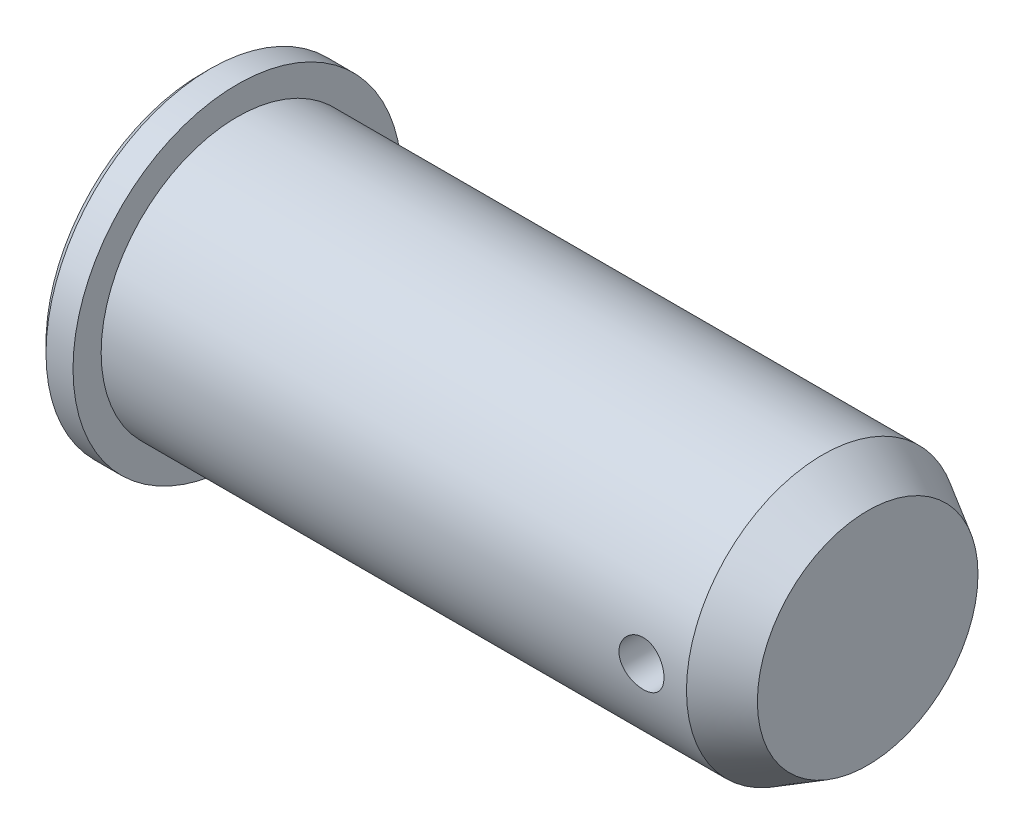
ISO-10303-21;
HEADER;
FILE_DESCRIPTION(('STEP AP214'),'2;1');
FILE_NAME('part.step','',(''),(''),'','','');
FILE_SCHEMA(('AUTOMOTIVE_DESIGN { 1 0 10303 214 1 1 1 1 }'));
ENDSEC;
DATA;
#1=APPLICATION_CONTEXT('core data for automotive mechanical design processes');
#2=APPLICATION_PROTOCOL_DEFINITION('international standard','automotive_design',2000,#1);
#3=PRODUCT_CONTEXT('',#1,'mechanical');
#4=PRODUCT('Part','Part','',(#3));
#5=PRODUCT_RELATED_PRODUCT_CATEGORY('part','',(#4));
#6=PRODUCT_DEFINITION_FORMATION('','',#4);
#7=PRODUCT_DEFINITION_CONTEXT('part definition',#1,'design');
#8=PRODUCT_DEFINITION('design','',#6,#7);
#9=PRODUCT_DEFINITION_SHAPE('','',#8);
#10=(LENGTH_UNIT() NAMED_UNIT(*) SI_UNIT(.MILLI.,.METRE.));
#11=(NAMED_UNIT(*) PLANE_ANGLE_UNIT() SI_UNIT($,.RADIAN.));
#12=(NAMED_UNIT(*) SI_UNIT($,.STERADIAN.) SOLID_ANGLE_UNIT());
#13=UNCERTAINTY_MEASURE_WITH_UNIT(LENGTH_MEASURE(1.E-05),#10,'distance_accuracy_value','');
#14=(GEOMETRIC_REPRESENTATION_CONTEXT(3) GLOBAL_UNCERTAINTY_ASSIGNED_CONTEXT((#13)) GLOBAL_UNIT_ASSIGNED_CONTEXT((#10,
#11,#12)) REPRESENTATION_CONTEXT('',''));
#15=CARTESIAN_POINT('',(0.,0.,0.));
#16=DIRECTION('',(0.,0.,1.));
#17=DIRECTION('',(1.,0.,0.));
#18=AXIS2_PLACEMENT_3D('',#15,#16,#17);
#19=CARTESIAN_POINT('',(0.,0.,0.));
#20=DIRECTION('',(1.,0.,0.));
#21=DIRECTION('',(0.,0.,-1.));
#22=AXIS2_PLACEMENT_3D('',#19,#20,#21);
#23=PLANE('',#22);
#24=CARTESIAN_POINT('',(0.,0.,0.));
#25=DIRECTION('',(1.,0.,0.));
#26=DIRECTION('',(0.,0.,-1.));
#27=AXIS2_PLACEMENT_3D('',#24,#25,#26);
#28=CIRCLE('',#27,34.5);
#29=CARTESIAN_POINT('',(0.,0.,-34.5));
#30=VERTEX_POINT('',#29);
#31=EDGE_CURVE('E44',#30,#30,#28,.F.);
#32=ORIENTED_EDGE('',*,*,#31,.T.);
#33=EDGE_LOOP('',(#32));
#34=FACE_BOUND('',#33,.T.);
#35=ADVANCED_FACE('F32',(#34),#23,.F.);
#36=CARTESIAN_POINT('',(0.,0.,0.));
#37=DIRECTION('',(-1.,0.,0.));
#38=DIRECTION('',(0.,0.,1.));
#39=AXIS2_PLACEMENT_3D('',#36,#37,#38);
#40=CYLINDRICAL_SURFACE('',#39,36.5);
#41=CARTESIAN_POINT('',(1.99999999999998,0.,0.));
#42=DIRECTION('',(1.,0.,0.));
#43=DIRECTION('',(0.,0.,-1.));
#44=AXIS2_PLACEMENT_3D('',#41,#42,#43);
#45=CIRCLE('',#44,36.5);
#46=CARTESIAN_POINT('',(1.99999999999998,0.,-36.5));
#47=VERTEX_POINT('',#46);
#48=EDGE_CURVE('E10',#47,#47,#45,.T.);
#49=ORIENTED_EDGE('',*,*,#48,.T.);
#50=EDGE_LOOP('',(#49));
#51=FACE_BOUND('',#50,.T.);
#52=CARTESIAN_POINT('',(8.,0.,0.));
#53=DIRECTION('',(-1.,0.,0.));
#54=DIRECTION('',(0.,0.,1.));
#55=AXIS2_PLACEMENT_3D('',#52,#53,#54);
#56=CIRCLE('',#55,36.5);
#57=CARTESIAN_POINT('',(8.,0.,36.5));
#58=VERTEX_POINT('',#57);
#59=EDGE_CURVE('E49',#58,#58,#56,.T.);
#60=ORIENTED_EDGE('',*,*,#59,.T.);
#61=EDGE_LOOP('',(#60));
#62=FACE_BOUND('',#61,.T.);
#63=ADVANCED_FACE('F80',(#51,#62),#40,.T.);
#64=CARTESIAN_POINT('',(8.,36.5,0.));
#65=DIRECTION('',(-1.,0.,0.));
#66=DIRECTION('',(0.,0.,1.));
#67=AXIS2_PLACEMENT_3D('',#64,#65,#66);
#68=PLANE('',#67);
#69=ORIENTED_EDGE('',*,*,#59,.F.);
#70=EDGE_LOOP('',(#69));
#71=FACE_BOUND('',#70,.T.);
#72=CARTESIAN_POINT('',(8.,0.,0.));
#73=DIRECTION('',(-1.,0.,0.));
#74=DIRECTION('',(0.,0.,1.));
#75=AXIS2_PLACEMENT_3D('',#72,#73,#74);
#76=CIRCLE('',#75,30.25);
#77=CARTESIAN_POINT('',(8.,0.,30.25));
#78=VERTEX_POINT('',#77);
#79=EDGE_CURVE('E95',#78,#78,#76,.T.);
#80=ORIENTED_EDGE('',*,*,#79,.T.);
#81=EDGE_LOOP('',(#80));
#82=FACE_BOUND('',#81,.T.);
#83=ADVANCED_FACE('F75',(#71,#82),#68,.F.);
#84=CARTESIAN_POINT('',(0.,0.,0.));
#85=DIRECTION('',(-1.,0.,0.));
#86=DIRECTION('',(0.,0.,1.));
#87=AXIS2_PLACEMENT_3D('',#84,#85,#86);
#88=CYLINDRICAL_SURFACE('',#87,30.25);
#89=CARTESIAN_POINT('',(133.,0.,30.25));
#90=CARTESIAN_POINT('',(133.000002126859,-0.139455638947402,30.2500009179522));
#91=CARTESIAN_POINT('',(132.994163818373,-0.278882400769712,30.2490338507295));
#92=CARTESIAN_POINT('',(132.970858655616,-0.556777272751613,30.2451945756554));
#93=CARTESIAN_POINT('',(132.953389486641,-0.695245186543638,30.2423219885796));
#94=CARTESIAN_POINT('',(132.906937833428,-0.970271296017669,30.2347485000166));
#95=CARTESIAN_POINT('',(132.877948037102,-1.10682822171105,30.23004643741));
#96=CARTESIAN_POINT('',(132.808664560122,-1.37702692567407,30.2189441547343));
#97=CARTESIAN_POINT('',(132.768366732031,-1.5106676149392,30.2125433116518));
#98=CARTESIAN_POINT('',(132.676829074361,-1.7738835271414,30.1982315866526));
#99=CARTESIAN_POINT('',(132.625602347021,-1.90346340694695,30.190322514089));
#100=CARTESIAN_POINT('',(132.512534266289,-2.15787371759553,30.1732057191485));
#101=CARTESIAN_POINT('',(132.45068900123,-2.28270237740314,30.1639975184211));
#102=CARTESIAN_POINT('',(132.316875749848,-2.52664355944191,30.144544096046));
#103=CARTESIAN_POINT('',(132.244912820146,-2.6457588974443,30.1342993931356));
#104=CARTESIAN_POINT('',(132.091319756201,-2.87757582316959,30.1130472170553));
#105=CARTESIAN_POINT('',(132.009686028237,-2.99027500343512,30.102039460965));
#106=CARTESIAN_POINT('',(131.83664276792,-3.20933189329885,30.0794765979095));
#107=CARTESIAN_POINT('',(131.745159779859,-3.3156312021363,30.0679177958889));
#108=CARTESIAN_POINT('',(131.553564644467,-3.52020245445551,30.0446547511578));
#109=CARTESIAN_POINT('',(131.453449315073,-3.61847141155652,30.032950456188));
#110=CARTESIAN_POINT('',(131.245337687113,-3.80623415171663,30.009732256655));
#111=CARTESIAN_POINT('',(131.137343796845,-3.89573059689259,29.9982182952204));
#112=CARTESIAN_POINT('',(130.914145944856,-4.0653919313069,29.9756971021855));
#113=CARTESIAN_POINT('',(130.798939338604,-4.14555336670428,29.9646900590438));
#114=CARTESIAN_POINT('',(130.561465578005,-4.29636938529597,29.9434391094942));
#115=CARTESIAN_POINT('',(130.439161945184,-4.36696721775163,29.933199906938));
#116=CARTESIAN_POINT('',(130.188907491808,-4.49762376501559,29.913847026984));
#117=CARTESIAN_POINT('',(130.060954584238,-4.55767854342854,29.9047337703484));
#118=CARTESIAN_POINT('',(129.800389201827,-4.66674686844475,29.8879077160845));
#119=CARTESIAN_POINT('',(129.667778718338,-4.71576506888978,29.8801943284345));
#120=CARTESIAN_POINT('',(129.398797512757,-4.80243382822669,29.8663862409762));
#121=CARTESIAN_POINT('',(129.26242543727,-4.84008023583317,29.860292132385));
#122=CARTESIAN_POINT('',(128.851728284335,-4.9348566895937,29.8448318664841));
#123=CARTESIAN_POINT('',(128.573144946642,-4.97494023323195,29.838109465173));
#124=CARTESIAN_POINT('',(128.01328456859,-5.0078499783523,29.8326027797222));
#125=CARTESIAN_POINT('',(127.732007717095,-5.00067946933101,29.8338179430247));
#126=CARTESIAN_POINT('',(127.177566791931,-4.93969180756979,29.8439754095978));
#127=CARTESIAN_POINT('',(126.904349391953,-4.886348069071,29.8528392877382));
#128=CARTESIAN_POINT('',(126.37080742075,-4.73525416789614,29.8771763703942));
#129=CARTESIAN_POINT('',(126.110483285399,-4.63750250508856,29.892649798184));
#130=CARTESIAN_POINT('',(125.608684669744,-4.39989085316462,29.9285464530083));
#131=CARTESIAN_POINT('',(125.367305169097,-4.25983388525597,29.9489927456377));
#132=CARTESIAN_POINT('',(124.911295082866,-3.94172602280416,29.9925155362905));
#133=CARTESIAN_POINT('',(124.696666623592,-3.76367211111488,30.0155922431139));
#134=CARTESIAN_POINT('',(124.297508762645,-3.3720431825576,30.0621205191662));
#135=CARTESIAN_POINT('',(124.113377965752,-3.15806179423527,30.0855732298983));
#136=CARTESIAN_POINT('',(123.78357592905,-2.7020272679772,30.1299509827977));
#137=CARTESIAN_POINT('',(123.637904929537,-2.45997395466277,30.1508760091717));
#138=CARTESIAN_POINT('',(123.38912257457,-1.95429434555043,30.1878697127002));
#139=CARTESIAN_POINT('',(123.28604604666,-1.69065060644195,30.2039344129259));
#140=CARTESIAN_POINT('',(123.125746518951,-1.14946879203915,30.2293653631587));
#141=CARTESIAN_POINT('',(123.06851974718,-0.871931861707351,30.2387321641823));
#142=CARTESIAN_POINT('',(123.002083652741,-0.314277946578055,30.2496379326016));
#143=CARTESIAN_POINT('',(122.992327054807,-0.0342278448328487,30.2512661121133));
#144=CARTESIAN_POINT('',(123.019649766251,0.523505861203211,30.2467554011814));
#145=CARTESIAN_POINT('',(123.056727304202,0.801189554599885,30.2406168045043));
#146=CARTESIAN_POINT('',(123.176210591497,1.34462042608354,30.2213175137807));
#147=CARTESIAN_POINT('',(123.258345768447,1.61042871214491,30.2081987498463));
#148=CARTESIAN_POINT('',(123.465324718166,2.12450244656325,30.1764043312468));
#149=CARTESIAN_POINT('',(123.590170856396,2.3727669223725,30.1577283688148));
#150=CARTESIAN_POINT('',(123.880283604538,2.84708544424052,30.1166703987549));
#151=CARTESIAN_POINT('',(124.045892528749,3.07292739503225,30.0942575527646));
#152=CARTESIAN_POINT('',(124.412359442995,3.49380974600917,30.0483061052849));
#153=CARTESIAN_POINT('',(124.613219948643,3.68884794609758,30.0247674235411));
#154=CARTESIAN_POINT('',(125.046937516672,4.04461212288573,29.9789291324084));
#155=CARTESIAN_POINT('',(125.280099490977,4.20496858526367,29.9566445763081));
#156=CARTESIAN_POINT('',(125.770383781267,4.48423645106497,29.9161181452449));
#157=CARTESIAN_POINT('',(126.027505346545,4.60314915245814,29.8978761436805));
#158=CARTESIAN_POINT('',(126.557317655249,4.79560433115695,29.867610825984));
#159=CARTESIAN_POINT('',(126.829939924203,4.8693316274071,29.8555622105322));
#160=CARTESIAN_POINT('',(127.384070229103,4.9698878685979,29.8389916440146));
#161=CARTESIAN_POINT('',(127.665577504395,4.99672081717076,29.8344690504119));
#162=CARTESIAN_POINT('',(128.086203724859,5.00120216452355,29.8337117032016));
#163=CARTESIAN_POINT('',(128.225352620461,4.99685885130023,29.8344427474576));
#164=CARTESIAN_POINT('',(128.502767535132,4.97659797500553,29.8378302016414));
#165=CARTESIAN_POINT('',(128.641033866142,4.96068475928357,29.8404858883905));
#166=CARTESIAN_POINT('',(128.915750978702,4.91739303740641,29.8476501119408));
#167=CARTESIAN_POINT('',(129.052201093401,4.8900104337176,29.852159310914));
#168=CARTESIAN_POINT('',(129.322234928827,4.82400282452436,29.8628969682249));
#169=CARTESIAN_POINT('',(129.455819663181,4.78538186742972,29.8691248074124));
#170=CARTESIAN_POINT('',(129.71913390499,4.69721639725925,29.8831164070874));
#171=CARTESIAN_POINT('',(129.848866328239,4.64768039790723,29.8908789700095));
#172=CARTESIAN_POINT('',(130.103645786332,4.53805027453649,29.9077192745733));
#173=CARTESIAN_POINT('',(130.228694480925,4.47795993438399,29.9167965446716));
#174=CARTESIAN_POINT('',(130.473353078271,4.34761363078593,29.9360166836689));
#175=CARTESIAN_POINT('',(130.592960829793,4.27735369163136,29.9461599688896));
#176=CARTESIAN_POINT('',(130.825838471266,4.12720543642081,29.9672223915387));
#177=CARTESIAN_POINT('',(130.93911057051,4.04732050771319,29.9781412554636));
#178=CARTESIAN_POINT('',(131.15992833887,3.87743356763734,30.00059059036));
#179=CARTESIAN_POINT('',(131.26738860573,3.78732129201922,30.0121268437462));
#180=CARTESIAN_POINT('',(131.474316457888,3.59843613951504,30.0353592582278));
#181=CARTESIAN_POINT('',(131.573786885365,3.49966636868972,30.0470553607132));
#182=CARTESIAN_POINT('',(131.76415264477,3.29405451597666,30.0702911920451));
#183=CARTESIAN_POINT('',(131.855042824382,3.18720765237878,30.0818308234164));
#184=CARTESIAN_POINT('',(132.027517983476,2.9662657661828,30.1044198065345));
#185=CARTESIAN_POINT('',(132.109106385386,2.85217343364193,30.1154693376849));
#186=CARTESIAN_POINT('',(132.262992992262,2.6166429839702,30.1368505151958));
#187=CARTESIAN_POINT('',(132.33522035033,2.49515804010251,30.1471764427747));
#188=CARTESIAN_POINT('',(132.469141583572,2.24648839745037,30.1667256782488));
#189=CARTESIAN_POINT('',(132.530839333711,2.11930581728148,30.1759493913899));
#190=CARTESIAN_POINT('',(132.643236752245,1.86018259009587,30.1930299949061));
#191=CARTESIAN_POINT('',(132.693944090686,1.72824533677824,30.2008878377385));
#192=CARTESIAN_POINT('',(132.784018867423,1.46051902607252,30.2150188577067));
#193=CARTESIAN_POINT('',(132.823388747966,1.3247308051703,30.2212923760922));
#194=CARTESIAN_POINT('',(132.904369219693,0.993482976959474,30.2343034133769));
#195=CARTESIAN_POINT('',(132.940188380187,0.796543057878599,30.2401622531852));
#196=CARTESIAN_POINT('',(132.988002046791,0.399715628918001,30.2480098563762));
#197=CARTESIAN_POINT('',(132.99999695239,0.19982816851972,30.249998684652));
#198=CARTESIAN_POINT('',(133.,0.,30.25));
#199=B_SPLINE_CURVE_WITH_KNOTS('',3,(#89,#90,#91,#92,#93,#94,#95,#96,#97,#98,#99,#100,#101,#102,
#103,#104,#105,#106,#107,#108,#109,#110,#111,#112,#113,#114,#115,#116,#117,#118,#119,#120,#121,
#122,#123,#124,#125,#126,#127,#128,#129,#130,#131,#132,#133,#134,#135,#136,#137,#138,#139,#140,
#141,#142,#143,#144,#145,#146,#147,#148,#149,#150,#151,#152,#153,#154,#155,#156,#157,#158,#159,
#160,#161,#162,#163,#164,#165,#166,#167,#168,#169,#170,#171,#172,#173,#174,#175,#176,#177,#178,
#179,#180,#181,#182,#183,#184,#185,#186,#187,#188,#189,#190,#191,#192,#193,#194,#195,#196,#197,
#198),.UNSPECIFIED.,.T.,.F.,(4,2,2,2,2,2,2,2,2,2,2,2,2,2,2,2,2,2,2,2,2,2,2,2,2,2,2,2,2,2,2,2,2,
2,2,2,2,2,2,2,2,2,2,2,2,2,2,2,2,2,2,2,2,2,4),(0.,0.418191773325813,0.83646679751265,
1.2550077239324,1.67370235934696,2.0918978305383,2.51024768879465,2.9283892018843,
3.34668658891097,3.76835376910454,4.19017705475311,4.61187193451698,5.03372234389671,
5.45797556938541,5.88238686036939,6.30661885142773,6.73100552220012,7.57117277431959,
8.41128154048952,9.24287734899524,10.0745012514927,10.9100586017145,11.7456823240449,
12.5914876713361,13.4372983030607,14.2837991533842,15.1302303565532,15.9668796976659,
16.8034973947537,17.6351453159911,18.4668393038362,19.3057713300135,20.1447632481757,
20.9922961831999,21.8398025721047,22.6838189130084,23.5277631920054,23.9450121997573,
24.3621045086599,24.7793459545038,25.1964372824786,25.6132044240045,26.0298224530314,
26.4466037970831,26.8632388882646,27.2848920366939,27.7063945224669,28.1281485256201,
28.549746847544,28.9743697147718,29.3988359794471,29.8230050547195,30.2470826895536,
30.8463262775182,31.4455598171905),.UNSPECIFIED.);
#200=CARTESIAN_POINT('',(133.,0.,30.25));
#201=VERTEX_POINT('',#200);
#202=EDGE_CURVE('E36',#201,#201,#199,.T.);
#203=ORIENTED_EDGE('',*,*,#202,.T.);
#204=EDGE_LOOP('',(#203));
#205=FACE_BOUND('',#204,.T.);
#206=CARTESIAN_POINT('',(133.,0.,-30.25));
#207=CARTESIAN_POINT('',(133.000002126859,0.139455638947402,-30.2500009179522));
#208=CARTESIAN_POINT('',(132.994163818373,0.278882400769712,-30.2490338507295));
#209=CARTESIAN_POINT('',(132.970858655616,0.556777272751613,-30.2451945756554));
#210=CARTESIAN_POINT('',(132.953389486641,0.695245186543638,-30.2423219885796));
#211=CARTESIAN_POINT('',(132.906937833428,0.970271296017669,-30.2347485000166));
#212=CARTESIAN_POINT('',(132.877948037102,1.10682822171105,-30.23004643741));
#213=CARTESIAN_POINT('',(132.808664560122,1.37702692567407,-30.2189441547343));
#214=CARTESIAN_POINT('',(132.768366732031,1.5106676149392,-30.2125433116518));
#215=CARTESIAN_POINT('',(132.676829074361,1.7738835271414,-30.1982315866526));
#216=CARTESIAN_POINT('',(132.625602347021,1.90346340694695,-30.190322514089));
#217=CARTESIAN_POINT('',(132.512534266289,2.15787371759553,-30.1732057191485));
#218=CARTESIAN_POINT('',(132.45068900123,2.28270237740314,-30.1639975184211));
#219=CARTESIAN_POINT('',(132.316875749848,2.52664355944191,-30.144544096046));
#220=CARTESIAN_POINT('',(132.244912820146,2.6457588974443,-30.1342993931356));
#221=CARTESIAN_POINT('',(132.091319756201,2.87757582316959,-30.1130472170553));
#222=CARTESIAN_POINT('',(132.009686028237,2.99027500343512,-30.102039460965));
#223=CARTESIAN_POINT('',(131.83664276792,3.20933189329885,-30.0794765979095));
#224=CARTESIAN_POINT('',(131.745159779859,3.3156312021363,-30.0679177958889));
#225=CARTESIAN_POINT('',(131.553564644467,3.52020245445551,-30.0446547511578));
#226=CARTESIAN_POINT('',(131.453449315073,3.61847141155652,-30.032950456188));
#227=CARTESIAN_POINT('',(131.245337687113,3.80623415171663,-30.009732256655));
#228=CARTESIAN_POINT('',(131.137343796845,3.89573059689259,-29.9982182952204));
#229=CARTESIAN_POINT('',(130.914145944856,4.0653919313069,-29.9756971021855));
#230=CARTESIAN_POINT('',(130.798939338604,4.14555336670428,-29.9646900590438));
#231=CARTESIAN_POINT('',(130.561465578005,4.29636938529597,-29.9434391094942));
#232=CARTESIAN_POINT('',(130.439161945184,4.36696721775163,-29.933199906938));
#233=CARTESIAN_POINT('',(130.188907491808,4.49762376501559,-29.913847026984));
#234=CARTESIAN_POINT('',(130.060954584238,4.55767854342854,-29.9047337703484));
#235=CARTESIAN_POINT('',(129.800389201827,4.66674686844475,-29.8879077160845));
#236=CARTESIAN_POINT('',(129.667778718338,4.71576506888978,-29.8801943284345));
#237=CARTESIAN_POINT('',(129.398797512757,4.80243382822669,-29.8663862409762));
#238=CARTESIAN_POINT('',(129.26242543727,4.84008023583317,-29.860292132385));
#239=CARTESIAN_POINT('',(128.851728284335,4.9348566895937,-29.8448318664841));
#240=CARTESIAN_POINT('',(128.573144946642,4.97494023323195,-29.838109465173));
#241=CARTESIAN_POINT('',(128.01328456859,5.0078499783523,-29.8326027797222));
#242=CARTESIAN_POINT('',(127.732007717095,5.00067946933101,-29.8338179430247));
#243=CARTESIAN_POINT('',(127.177566791931,4.93969180756979,-29.8439754095978));
#244=CARTESIAN_POINT('',(126.904349391953,4.886348069071,-29.8528392877382));
#245=CARTESIAN_POINT('',(126.37080742075,4.73525416789614,-29.8771763703942));
#246=CARTESIAN_POINT('',(126.110483285399,4.63750250508856,-29.892649798184));
#247=CARTESIAN_POINT('',(125.608684669744,4.39989085316462,-29.9285464530083));
#248=CARTESIAN_POINT('',(125.367305169097,4.25983388525597,-29.9489927456377));
#249=CARTESIAN_POINT('',(124.911295082866,3.94172602280416,-29.9925155362905));
#250=CARTESIAN_POINT('',(124.696666623592,3.76367211111488,-30.0155922431139));
#251=CARTESIAN_POINT('',(124.297508762645,3.3720431825576,-30.0621205191662));
#252=CARTESIAN_POINT('',(124.113377965752,3.15806179423527,-30.0855732298983));
#253=CARTESIAN_POINT('',(123.78357592905,2.7020272679772,-30.1299509827977));
#254=CARTESIAN_POINT('',(123.637904929537,2.45997395466277,-30.1508760091717));
#255=CARTESIAN_POINT('',(123.38912257457,1.95429434555043,-30.1878697127002));
#256=CARTESIAN_POINT('',(123.28604604666,1.69065060644195,-30.2039344129259));
#257=CARTESIAN_POINT('',(123.125746518951,1.14946879203915,-30.2293653631587));
#258=CARTESIAN_POINT('',(123.06851974718,0.871931861707351,-30.2387321641823));
#259=CARTESIAN_POINT('',(123.002083652741,0.314277946578055,-30.2496379326016));
#260=CARTESIAN_POINT('',(122.992327054807,0.0342278448328487,-30.2512661121133));
#261=CARTESIAN_POINT('',(123.019649766251,-0.523505861203211,-30.2467554011814));
#262=CARTESIAN_POINT('',(123.056727304202,-0.801189554599885,-30.2406168045043));
#263=CARTESIAN_POINT('',(123.176210591497,-1.34462042608354,-30.2213175137807));
#264=CARTESIAN_POINT('',(123.258345768447,-1.61042871214491,-30.2081987498463));
#265=CARTESIAN_POINT('',(123.465324718166,-2.12450244656325,-30.1764043312468));
#266=CARTESIAN_POINT('',(123.590170856396,-2.3727669223725,-30.1577283688148));
#267=CARTESIAN_POINT('',(123.880283604538,-2.84708544424052,-30.1166703987549));
#268=CARTESIAN_POINT('',(124.045892528749,-3.07292739503225,-30.0942575527646));
#269=CARTESIAN_POINT('',(124.412359442995,-3.49380974600917,-30.0483061052849));
#270=CARTESIAN_POINT('',(124.613219948643,-3.68884794609758,-30.0247674235411));
#271=CARTESIAN_POINT('',(125.046937516672,-4.04461212288573,-29.9789291324084));
#272=CARTESIAN_POINT('',(125.280099490977,-4.20496858526367,-29.9566445763081));
#273=CARTESIAN_POINT('',(125.770383781267,-4.48423645106497,-29.9161181452449));
#274=CARTESIAN_POINT('',(126.027505346545,-4.60314915245814,-29.8978761436805));
#275=CARTESIAN_POINT('',(126.557317655249,-4.79560433115695,-29.867610825984));
#276=CARTESIAN_POINT('',(126.829939924203,-4.8693316274071,-29.8555622105322));
#277=CARTESIAN_POINT('',(127.384070229103,-4.9698878685979,-29.8389916440146));
#278=CARTESIAN_POINT('',(127.665577504395,-4.99672081717076,-29.8344690504119));
#279=CARTESIAN_POINT('',(128.086203724859,-5.00120216452355,-29.8337117032016));
#280=CARTESIAN_POINT('',(128.225352620461,-4.99685885130023,-29.8344427474576));
#281=CARTESIAN_POINT('',(128.502767535132,-4.97659797500553,-29.8378302016414));
#282=CARTESIAN_POINT('',(128.641033866142,-4.96068475928357,-29.8404858883905));
#283=CARTESIAN_POINT('',(128.915750978702,-4.91739303740641,-29.8476501119408));
#284=CARTESIAN_POINT('',(129.052201093401,-4.8900104337176,-29.852159310914));
#285=CARTESIAN_POINT('',(129.322234928827,-4.82400282452436,-29.8628969682249));
#286=CARTESIAN_POINT('',(129.455819663181,-4.78538186742972,-29.8691248074124));
#287=CARTESIAN_POINT('',(129.71913390499,-4.69721639725925,-29.8831164070874));
#288=CARTESIAN_POINT('',(129.848866328239,-4.64768039790723,-29.8908789700095));
#289=CARTESIAN_POINT('',(130.103645786332,-4.53805027453649,-29.9077192745733));
#290=CARTESIAN_POINT('',(130.228694480925,-4.47795993438399,-29.9167965446716));
#291=CARTESIAN_POINT('',(130.473353078271,-4.34761363078593,-29.9360166836689));
#292=CARTESIAN_POINT('',(130.592960829793,-4.27735369163136,-29.9461599688896));
#293=CARTESIAN_POINT('',(130.825838471266,-4.12720543642081,-29.9672223915387));
#294=CARTESIAN_POINT('',(130.93911057051,-4.04732050771319,-29.9781412554636));
#295=CARTESIAN_POINT('',(131.15992833887,-3.87743356763734,-30.00059059036));
#296=CARTESIAN_POINT('',(131.26738860573,-3.78732129201922,-30.0121268437462));
#297=CARTESIAN_POINT('',(131.474316457888,-3.59843613951504,-30.0353592582278));
#298=CARTESIAN_POINT('',(131.573786885365,-3.49966636868972,-30.0470553607132));
#299=CARTESIAN_POINT('',(131.76415264477,-3.29405451597666,-30.0702911920451));
#300=CARTESIAN_POINT('',(131.855042824382,-3.18720765237878,-30.0818308234164));
#301=CARTESIAN_POINT('',(132.027517983476,-2.9662657661828,-30.1044198065345));
#302=CARTESIAN_POINT('',(132.109106385386,-2.85217343364193,-30.1154693376849));
#303=CARTESIAN_POINT('',(132.262992992262,-2.6166429839702,-30.1368505151958));
#304=CARTESIAN_POINT('',(132.33522035033,-2.49515804010251,-30.1471764427747));
#305=CARTESIAN_POINT('',(132.469141583572,-2.24648839745037,-30.1667256782488));
#306=CARTESIAN_POINT('',(132.530839333711,-2.11930581728148,-30.1759493913899));
#307=CARTESIAN_POINT('',(132.643236752245,-1.86018259009587,-30.1930299949061));
#308=CARTESIAN_POINT('',(132.693944090686,-1.72824533677824,-30.2008878377385));
#309=CARTESIAN_POINT('',(132.784018867423,-1.46051902607252,-30.2150188577067));
#310=CARTESIAN_POINT('',(132.823388747966,-1.3247308051703,-30.2212923760922));
#311=CARTESIAN_POINT('',(132.904369219693,-0.993482976959474,-30.2343034133769));
#312=CARTESIAN_POINT('',(132.940188380187,-0.796543057878599,-30.2401622531852));
#313=CARTESIAN_POINT('',(132.988002046791,-0.399715628918001,-30.2480098563762));
#314=CARTESIAN_POINT('',(132.99999695239,-0.19982816851972,-30.249998684652));
#315=CARTESIAN_POINT('',(133.,0.,-30.25));
#316=B_SPLINE_CURVE_WITH_KNOTS('',3,(#206,#207,#208,#209,#210,#211,#212,#213,#214,#215,#216,
#217,#218,#219,#220,#221,#222,#223,#224,#225,#226,#227,#228,#229,#230,#231,#232,#233,#234,#235,
#236,#237,#238,#239,#240,#241,#242,#243,#244,#245,#246,#247,#248,#249,#250,#251,#252,#253,#254,
#255,#256,#257,#258,#259,#260,#261,#262,#263,#264,#265,#266,#267,#268,#269,#270,#271,#272,#273,
#274,#275,#276,#277,#278,#279,#280,#281,#282,#283,#284,#285,#286,#287,#288,#289,#290,#291,#292,
#293,#294,#295,#296,#297,#298,#299,#300,#301,#302,#303,#304,#305,#306,#307,#308,#309,#310,#311,
#312,#313,#314,#315),.UNSPECIFIED.,.T.,.F.,(4,2,2,2,2,2,2,2,2,2,2,2,2,2,2,2,2,2,2,2,2,2,2,2,2,2,
2,2,2,2,2,2,2,2,2,2,2,2,2,2,2,2,2,2,2,2,2,2,2,2,2,2,2,2,4),(0.,0.418191773325813,
0.83646679751265,1.2550077239324,1.67370235934696,2.0918978305383,2.51024768879465,
2.9283892018843,3.34668658891097,3.76835376910454,4.19017705475311,4.61187193451698,
5.03372234389671,5.45797556938541,5.88238686036939,6.30661885142773,6.73100552220012,
7.57117277431959,8.41128154048952,9.24287734899524,10.0745012514927,10.9100586017145,
11.7456823240449,12.5914876713361,13.4372983030607,14.2837991533842,15.1302303565532,
15.9668796976659,16.8034973947537,17.6351453159911,18.4668393038362,19.3057713300135,
20.1447632481757,20.9922961831999,21.8398025721047,22.6838189130084,23.5277631920054,
23.9450121997573,24.3621045086599,24.7793459545038,25.1964372824786,25.6132044240045,
26.0298224530314,26.4466037970831,26.8632388882646,27.2848920366939,27.7063945224669,
28.1281485256201,28.549746847544,28.9743697147718,29.3988359794471,29.8230050547195,
30.2470826895536,30.8463262775182,31.4455598171905),.UNSPECIFIED.);
#317=CARTESIAN_POINT('',(133.,0.,-30.25));
#318=VERTEX_POINT('',#317);
#319=EDGE_CURVE('E52',#318,#318,#316,.T.);
#320=ORIENTED_EDGE('',*,*,#319,.T.);
#321=EDGE_LOOP('',(#320));
#322=FACE_BOUND('',#321,.T.);
#323=ORIENTED_EDGE('',*,*,#79,.F.);
#324=EDGE_LOOP('',(#323));
#325=FACE_BOUND('',#324,.T.);
#326=CARTESIAN_POINT('',(138.,0.,0.));
#327=DIRECTION('',(-1.,0.,0.));
#328=DIRECTION('',(0.,0.,1.));
#329=AXIS2_PLACEMENT_3D('',#326,#327,#328);
#330=CIRCLE('',#329,30.25);
#331=CARTESIAN_POINT('',(138.,0.,30.25));
#332=VERTEX_POINT('',#331);
#333=EDGE_CURVE('E97',#332,#332,#330,.T.);
#334=ORIENTED_EDGE('',*,*,#333,.T.);
#335=EDGE_LOOP('',(#334));
#336=FACE_BOUND('',#335,.T.);
#337=ADVANCED_FACE('F56',(#205,#322,#325,#336),#88,.T.);
#338=CARTESIAN_POINT('',(148.,0.,0.));
#339=DIRECTION('',(-1.,0.,0.));
#340=DIRECTION('',(0.,0.,1.));
#341=AXIS2_PLACEMENT_3D('',#338,#339,#340);
#342=CONICAL_SURFACE('',#341,24.5,0.52183427981441);
#343=ORIENTED_EDGE('',*,*,#333,.F.);
#344=EDGE_LOOP('',(#343));
#345=FACE_BOUND('',#344,.T.);
#346=CARTESIAN_POINT('',(148.,0.,0.));
#347=DIRECTION('',(-1.,0.,0.));
#348=DIRECTION('',(0.,0.,1.));
#349=AXIS2_PLACEMENT_3D('',#346,#347,#348);
#350=CIRCLE('',#349,24.5);
#351=CARTESIAN_POINT('',(148.,0.,24.5));
#352=VERTEX_POINT('',#351);
#353=EDGE_CURVE('E100',#352,#352,#350,.T.);
#354=ORIENTED_EDGE('',*,*,#353,.T.);
#355=EDGE_LOOP('',(#354));
#356=FACE_BOUND('',#355,.T.);
#357=ADVANCED_FACE('F68',(#345,#356),#342,.T.);
#358=CARTESIAN_POINT('',(148.,24.5,0.));
#359=DIRECTION('',(-1.,0.,0.));
#360=DIRECTION('',(0.,0.,1.));
#361=AXIS2_PLACEMENT_3D('',#358,#359,#360);
#362=PLANE('',#361);
#363=ORIENTED_EDGE('',*,*,#353,.F.);
#364=EDGE_LOOP('',(#363));
#365=FACE_BOUND('',#364,.T.);
#366=ADVANCED_FACE('F65',(#365),#362,.F.);
#367=CARTESIAN_POINT('',(0.,0.,0.));
#368=DIRECTION('',(1.,0.,0.));
#369=DIRECTION('',(0.,0.,-1.));
#370=AXIS2_PLACEMENT_3D('',#367,#368,#369);
#371=CONICAL_SURFACE('',#370,34.5,0.785398163397445);
#372=ORIENTED_EDGE('',*,*,#48,.F.);
#373=EDGE_LOOP('',(#372));
#374=FACE_BOUND('',#373,.T.);
#375=ORIENTED_EDGE('',*,*,#31,.F.);
#376=EDGE_LOOP('',(#375));
#377=FACE_BOUND('',#376,.T.);
#378=ADVANCED_FACE('F34',(#374,#377),#371,.T.);
#379=CARTESIAN_POINT('',(128.,0.,-36.5));
#380=DIRECTION('',(0.,0.,1.));
#381=DIRECTION('',(1.,0.,0.));
#382=AXIS2_PLACEMENT_3D('',#379,#380,#381);
#383=CYLINDRICAL_SURFACE('',#382,4.99999999999999);
#384=ORIENTED_EDGE('',*,*,#319,.F.);
#385=EDGE_LOOP('',(#384));
#386=FACE_BOUND('',#385,.T.);
#387=ORIENTED_EDGE('',*,*,#202,.F.);
#388=EDGE_LOOP('',(#387));
#389=FACE_BOUND('',#388,.T.);
#390=ADVANCED_FACE('F60',(#386,#389),#383,.F.);
#391=CLOSED_SHELL('',(#35,#63,#83,#337,#357,#366,#378,#390));
#392=MANIFOLD_SOLID_BREP('B2',#391);
#393=ADVANCED_BREP_SHAPE_REPRESENTATION('',(#18,#392),#14);
#394=SHAPE_DEFINITION_REPRESENTATION(#9,#393);
ENDSEC;
END-ISO-10303-21;
